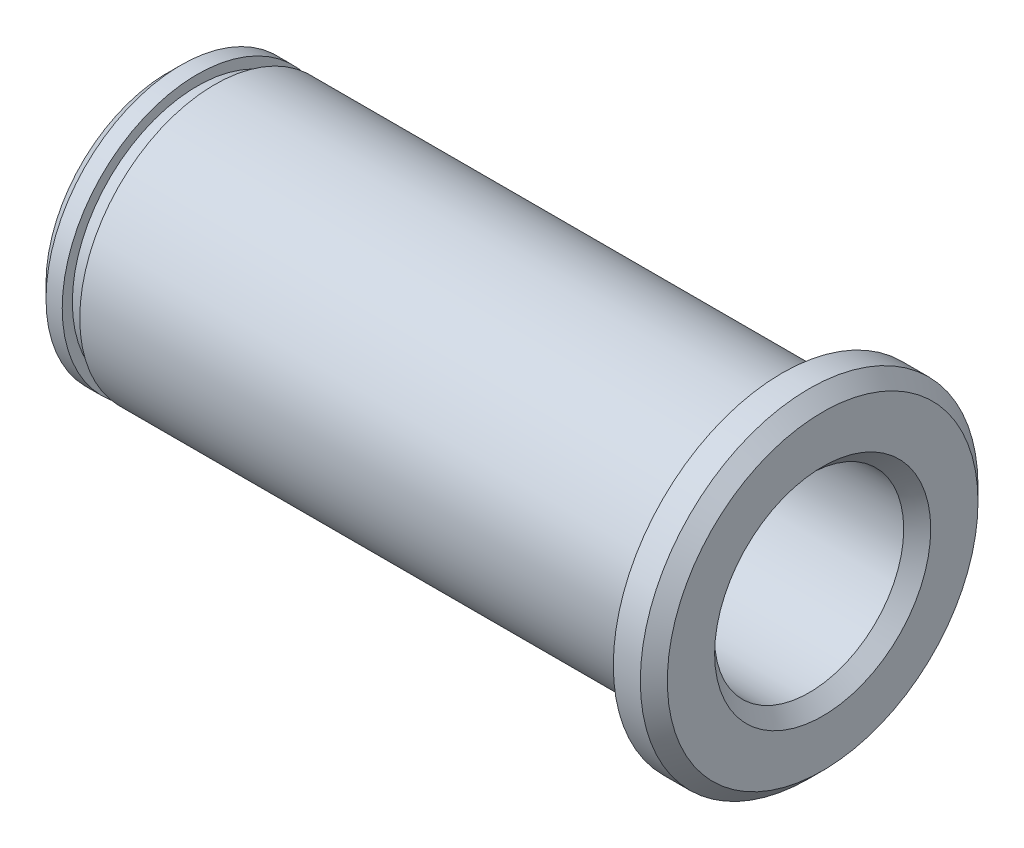
ISO-10303-21;
HEADER;
FILE_DESCRIPTION(('STEP AP214'),'2;1');
FILE_NAME('part.step','',(''),(''),'','','');
FILE_SCHEMA(('AUTOMOTIVE_DESIGN { 1 0 10303 214 1 1 1 1 }'));
ENDSEC;
DATA;
#1=APPLICATION_CONTEXT('core data for automotive mechanical design processes');
#2=APPLICATION_PROTOCOL_DEFINITION('international standard','automotive_design',2000,#1);
#3=PRODUCT_CONTEXT('',#1,'mechanical');
#4=PRODUCT('Part','Part','',(#3));
#5=PRODUCT_RELATED_PRODUCT_CATEGORY('part','',(#4));
#6=PRODUCT_DEFINITION_FORMATION('','',#4);
#7=PRODUCT_DEFINITION_CONTEXT('part definition',#1,'design');
#8=PRODUCT_DEFINITION('design','',#6,#7);
#9=PRODUCT_DEFINITION_SHAPE('','',#8);
#10=(LENGTH_UNIT() NAMED_UNIT(*) SI_UNIT(.MILLI.,.METRE.));
#11=(NAMED_UNIT(*) PLANE_ANGLE_UNIT() SI_UNIT($,.RADIAN.));
#12=(NAMED_UNIT(*) SI_UNIT($,.STERADIAN.) SOLID_ANGLE_UNIT());
#13=UNCERTAINTY_MEASURE_WITH_UNIT(LENGTH_MEASURE(1.E-05),#10,'distance_accuracy_value','');
#14=(GEOMETRIC_REPRESENTATION_CONTEXT(3) GLOBAL_UNCERTAINTY_ASSIGNED_CONTEXT((#13)) GLOBAL_UNIT_ASSIGNED_CONTEXT((#10,
#11,#12)) REPRESENTATION_CONTEXT('',''));
#15=CARTESIAN_POINT('',(0.,0.,0.));
#16=DIRECTION('',(0.,0.,1.));
#17=DIRECTION('',(1.,0.,0.));
#18=AXIS2_PLACEMENT_3D('',#15,#16,#17);
#19=CARTESIAN_POINT('',(0.,-10.,0.));
#20=DIRECTION('',(-1.,0.,0.));
#21=DIRECTION('',(0.,0.,1.));
#22=AXIS2_PLACEMENT_3D('',#19,#20,#21);
#23=PLANE('',#22);
#24=CARTESIAN_POINT('',(0.,0.,0.));
#25=DIRECTION('',(-1.,0.,0.));
#26=DIRECTION('',(0.,0.,1.));
#27=AXIS2_PLACEMENT_3D('',#24,#25,#26);
#28=CIRCLE('',#27,9.);
#29=CARTESIAN_POINT('',(0.,0.,9.));
#30=VERTEX_POINT('',#29);
#31=EDGE_CURVE('E62',#30,#30,#28,.T.);
#32=ORIENTED_EDGE('',*,*,#31,.T.);
#33=EDGE_LOOP('',(#32));
#34=FACE_BOUND('',#33,.T.);
#35=CARTESIAN_POINT('',(0.,0.,0.));
#36=DIRECTION('',(-1.,0.,0.));
#37=DIRECTION('',(0.,0.,1.));
#38=AXIS2_PLACEMENT_3D('',#35,#36,#37);
#39=CIRCLE('',#38,8.00000000000002);
#40=CARTESIAN_POINT('',(0.,0.,8.00000000000002));
#41=VERTEX_POINT('',#40);
#42=EDGE_CURVE('E65',#41,#41,#39,.F.);
#43=ORIENTED_EDGE('',*,*,#42,.T.);
#44=EDGE_LOOP('',(#43));
#45=FACE_BOUND('',#44,.T.);
#46=ADVANCED_FACE('F30',(#34,#45),#23,.T.);
#47=CARTESIAN_POINT('',(0.,0.,0.));
#48=DIRECTION('',(-1.,0.,0.));
#49=DIRECTION('',(0.,0.,1.));
#50=AXIS2_PLACEMENT_3D('',#47,#48,#49);
#51=CYLINDRICAL_SURFACE('',#50,7.00000000000001);
#52=CARTESIAN_POINT('',(1.00000000000001,0.,0.));
#53=DIRECTION('',(-1.,0.,0.));
#54=DIRECTION('',(0.,0.,1.));
#55=AXIS2_PLACEMENT_3D('',#52,#53,#54);
#56=CIRCLE('',#55,7.00000000000001);
#57=CARTESIAN_POINT('',(1.00000000000001,0.,7.00000000000001));
#58=VERTEX_POINT('',#57);
#59=EDGE_CURVE('E41',#58,#58,#56,.T.);
#60=ORIENTED_EDGE('',*,*,#59,.T.);
#61=EDGE_LOOP('',(#60));
#62=FACE_BOUND('',#61,.T.);
#63=CARTESIAN_POINT('',(47.5,0.,0.));
#64=DIRECTION('',(1.,0.,0.));
#65=DIRECTION('',(0.,0.,-1.));
#66=AXIS2_PLACEMENT_3D('',#63,#64,#65);
#67=CIRCLE('',#66,7.00000000000001);
#68=CARTESIAN_POINT('',(47.5,0.,-7.00000000000001));
#69=VERTEX_POINT('',#68);
#70=EDGE_CURVE('E45',#69,#69,#67,.T.);
#71=ORIENTED_EDGE('',*,*,#70,.T.);
#72=EDGE_LOOP('',(#71));
#73=FACE_BOUND('',#72,.T.);
#74=ADVANCED_FACE('F102',(#62,#73),#51,.F.);
#75=CARTESIAN_POINT('',(48.5,-7.00000000000001,0.));
#76=DIRECTION('',(1.,0.,0.));
#77=DIRECTION('',(0.,0.,-1.));
#78=AXIS2_PLACEMENT_3D('',#75,#76,#77);
#79=PLANE('',#78);
#80=CARTESIAN_POINT('',(48.5,0.,0.));
#81=DIRECTION('',(1.,0.,0.));
#82=DIRECTION('',(0.,0.,-1.));
#83=AXIS2_PLACEMENT_3D('',#80,#81,#82);
#84=CIRCLE('',#83,11.5);
#85=CARTESIAN_POINT('',(48.5,0.,-11.5));
#86=VERTEX_POINT('',#85);
#87=EDGE_CURVE('E50',#86,#86,#84,.T.);
#88=ORIENTED_EDGE('',*,*,#87,.T.);
#89=EDGE_LOOP('',(#88));
#90=FACE_BOUND('',#89,.T.);
#91=CARTESIAN_POINT('',(48.5,0.,0.));
#92=DIRECTION('',(1.,0.,0.));
#93=DIRECTION('',(0.,0.,-1.));
#94=AXIS2_PLACEMENT_3D('',#91,#92,#93);
#95=CIRCLE('',#94,8.00000000000001);
#96=CARTESIAN_POINT('',(48.5,0.,-8.00000000000001));
#97=VERTEX_POINT('',#96);
#98=EDGE_CURVE('E53',#97,#97,#95,.F.);
#99=ORIENTED_EDGE('',*,*,#98,.T.);
#100=EDGE_LOOP('',(#99));
#101=FACE_BOUND('',#100,.T.);
#102=ADVANCED_FACE('F108',(#90,#101),#79,.T.);
#103=CARTESIAN_POINT('',(0.,0.,0.));
#104=DIRECTION('',(-1.,0.,0.));
#105=DIRECTION('',(0.,0.,1.));
#106=AXIS2_PLACEMENT_3D('',#103,#104,#105);
#107=CYLINDRICAL_SURFACE('',#106,12.5);
#108=CARTESIAN_POINT('',(47.5,0.,0.));
#109=DIRECTION('',(1.,0.,0.));
#110=DIRECTION('',(0.,0.,-1.));
#111=AXIS2_PLACEMENT_3D('',#108,#109,#110);
#112=CIRCLE('',#111,12.5);
#113=CARTESIAN_POINT('',(47.5,0.,-12.5));
#114=VERTEX_POINT('',#113);
#115=EDGE_CURVE('E56',#114,#114,#112,.F.);
#116=ORIENTED_EDGE('',*,*,#115,.T.);
#117=EDGE_LOOP('',(#116));
#118=FACE_BOUND('',#117,.T.);
#119=CARTESIAN_POINT('',(45.5,0.,0.));
#120=DIRECTION('',(-1.,0.,0.));
#121=DIRECTION('',(0.,0.,1.));
#122=AXIS2_PLACEMENT_3D('',#119,#120,#121);
#123=CIRCLE('',#122,12.5);
#124=CARTESIAN_POINT('',(45.5,0.,12.5));
#125=VERTEX_POINT('',#124);
#126=EDGE_CURVE('E68',#125,#125,#123,.T.);
#127=ORIENTED_EDGE('',*,*,#126,.F.);
#128=EDGE_LOOP('',(#127));
#129=FACE_BOUND('',#128,.T.);
#130=ADVANCED_FACE('F136',(#118,#129),#107,.T.);
#131=CARTESIAN_POINT('',(45.5,-12.5,0.));
#132=DIRECTION('',(-1.,0.,0.));
#133=DIRECTION('',(0.,0.,1.));
#134=AXIS2_PLACEMENT_3D('',#131,#132,#133);
#135=PLANE('',#134);
#136=CARTESIAN_POINT('',(45.5,0.,0.));
#137=DIRECTION('',(-1.,0.,0.));
#138=DIRECTION('',(0.,0.,1.));
#139=AXIS2_PLACEMENT_3D('',#136,#137,#138);
#140=CIRCLE('',#139,10.5);
#141=CARTESIAN_POINT('',(45.5,0.,10.5));
#142=VERTEX_POINT('',#141);
#143=EDGE_CURVE('E10',#142,#142,#140,.F.);
#144=ORIENTED_EDGE('',*,*,#143,.T.);
#145=EDGE_LOOP('',(#144));
#146=FACE_BOUND('',#145,.T.);
#147=ORIENTED_EDGE('',*,*,#126,.T.);
#148=EDGE_LOOP('',(#147));
#149=FACE_BOUND('',#148,.T.);
#150=ADVANCED_FACE('F141',(#146,#149),#135,.T.);
#151=CARTESIAN_POINT('',(0.,0.,0.));
#152=DIRECTION('',(-1.,0.,0.));
#153=DIRECTION('',(0.,0.,1.));
#154=AXIS2_PLACEMENT_3D('',#151,#152,#153);
#155=CYLINDRICAL_SURFACE('',#154,10.);
#156=CARTESIAN_POINT('',(45.,0.,0.));
#157=DIRECTION('',(-1.,0.,0.));
#158=DIRECTION('',(0.,0.,1.));
#159=AXIS2_PLACEMENT_3D('',#156,#157,#158);
#160=CIRCLE('',#159,10.);
#161=CARTESIAN_POINT('',(45.,0.,10.));
#162=VERTEX_POINT('',#161);
#163=EDGE_CURVE('E37',#162,#162,#160,.T.);
#164=ORIENTED_EDGE('',*,*,#163,.T.);
#165=EDGE_LOOP('',(#164));
#166=FACE_BOUND('',#165,.T.);
#167=CARTESIAN_POINT('',(3.5,0.,0.));
#168=DIRECTION('',(-1.,0.,0.));
#169=DIRECTION('',(0.,0.,1.));
#170=AXIS2_PLACEMENT_3D('',#167,#168,#169);
#171=CIRCLE('',#170,10.);
#172=CARTESIAN_POINT('',(3.5,0.,10.));
#173=VERTEX_POINT('',#172);
#174=EDGE_CURVE('E71',#173,#173,#171,.T.);
#175=ORIENTED_EDGE('',*,*,#174,.F.);
#176=EDGE_LOOP('',(#175));
#177=FACE_BOUND('',#176,.T.);
#178=ADVANCED_FACE('F147',(#166,#177),#155,.T.);
#179=CARTESIAN_POINT('',(3.5,-10.,0.));
#180=DIRECTION('',(-1.,0.,0.));
#181=DIRECTION('',(0.,0.,1.));
#182=AXIS2_PLACEMENT_3D('',#179,#180,#181);
#183=PLANE('',#182);
#184=ORIENTED_EDGE('',*,*,#174,.T.);
#185=EDGE_LOOP('',(#184));
#186=FACE_BOUND('',#185,.T.);
#187=CARTESIAN_POINT('',(3.5,0.,0.));
#188=DIRECTION('',(-1.,0.,0.));
#189=DIRECTION('',(0.,0.,1.));
#190=AXIS2_PLACEMENT_3D('',#187,#188,#189);
#191=CIRCLE('',#190,9.25);
#192=CARTESIAN_POINT('',(3.5,0.,9.25));
#193=VERTEX_POINT('',#192);
#194=EDGE_CURVE('E74',#193,#193,#191,.T.);
#195=ORIENTED_EDGE('',*,*,#194,.F.);
#196=EDGE_LOOP('',(#195));
#197=FACE_BOUND('',#196,.T.);
#198=ADVANCED_FACE('F98',(#186,#197),#183,.T.);
#199=CARTESIAN_POINT('',(0.,0.,0.));
#200=DIRECTION('',(-1.,0.,0.));
#201=DIRECTION('',(0.,0.,1.));
#202=AXIS2_PLACEMENT_3D('',#199,#200,#201);
#203=CYLINDRICAL_SURFACE('',#202,9.25);
#204=ORIENTED_EDGE('',*,*,#194,.T.);
#205=EDGE_LOOP('',(#204));
#206=FACE_BOUND('',#205,.T.);
#207=CARTESIAN_POINT('',(2.2,0.,0.));
#208=DIRECTION('',(-1.,0.,0.));
#209=DIRECTION('',(0.,0.,1.));
#210=AXIS2_PLACEMENT_3D('',#207,#208,#209);
#211=CIRCLE('',#210,9.25);
#212=CARTESIAN_POINT('',(2.2,0.,9.25));
#213=VERTEX_POINT('',#212);
#214=EDGE_CURVE('E77',#213,#213,#211,.T.);
#215=ORIENTED_EDGE('',*,*,#214,.F.);
#216=EDGE_LOOP('',(#215));
#217=FACE_BOUND('',#216,.T.);
#218=ADVANCED_FACE('F88',(#206,#217),#203,.T.);
#219=CARTESIAN_POINT('',(2.2,-9.25,0.));
#220=DIRECTION('',(1.,0.,0.));
#221=DIRECTION('',(0.,0.,-1.));
#222=AXIS2_PLACEMENT_3D('',#219,#220,#221);
#223=PLANE('',#222);
#224=ORIENTED_EDGE('',*,*,#214,.T.);
#225=EDGE_LOOP('',(#224));
#226=FACE_BOUND('',#225,.T.);
#227=CARTESIAN_POINT('',(2.2,0.,0.));
#228=DIRECTION('',(-1.,0.,0.));
#229=DIRECTION('',(0.,0.,1.));
#230=AXIS2_PLACEMENT_3D('',#227,#228,#229);
#231=CIRCLE('',#230,10.);
#232=CARTESIAN_POINT('',(2.2,0.,10.));
#233=VERTEX_POINT('',#232);
#234=EDGE_CURVE('E80',#233,#233,#231,.T.);
#235=ORIENTED_EDGE('',*,*,#234,.F.);
#236=EDGE_LOOP('',(#235));
#237=FACE_BOUND('',#236,.T.);
#238=ADVANCED_FACE('F86',(#226,#237),#223,.T.);
#239=CARTESIAN_POINT('',(0.,0.,0.));
#240=DIRECTION('',(-1.,0.,0.));
#241=DIRECTION('',(0.,0.,1.));
#242=AXIS2_PLACEMENT_3D('',#239,#240,#241);
#243=CYLINDRICAL_SURFACE('',#242,10.);
#244=CARTESIAN_POINT('',(0.999999999999997,0.,0.));
#245=DIRECTION('',(-1.,0.,0.));
#246=DIRECTION('',(0.,0.,1.));
#247=AXIS2_PLACEMENT_3D('',#244,#245,#246);
#248=CIRCLE('',#247,10.);
#249=CARTESIAN_POINT('',(0.999999999999997,0.,10.));
#250=VERTEX_POINT('',#249);
#251=EDGE_CURVE('E59',#250,#250,#248,.F.);
#252=ORIENTED_EDGE('',*,*,#251,.T.);
#253=EDGE_LOOP('',(#252));
#254=FACE_BOUND('',#253,.T.);
#255=ORIENTED_EDGE('',*,*,#234,.T.);
#256=EDGE_LOOP('',(#255));
#257=FACE_BOUND('',#256,.T.);
#258=ADVANCED_FACE('F84',(#254,#257),#243,.T.);
#259=CARTESIAN_POINT('',(0.,0.,0.));
#260=DIRECTION('',(1.,0.,0.));
#261=DIRECTION('',(0.,0.,-1.));
#262=AXIS2_PLACEMENT_3D('',#259,#260,#261);
#263=CONICAL_SURFACE('',#262,9.,0.785398163397452);
#264=ORIENTED_EDGE('',*,*,#251,.F.);
#265=EDGE_LOOP('',(#264));
#266=FACE_BOUND('',#265,.T.);
#267=ORIENTED_EDGE('',*,*,#31,.F.);
#268=EDGE_LOOP('',(#267));
#269=FACE_BOUND('',#268,.T.);
#270=ADVANCED_FACE('F95',(#266,#269),#263,.T.);
#271=CARTESIAN_POINT('',(47.5,0.,0.));
#272=DIRECTION('',(-1.,0.,0.));
#273=DIRECTION('',(0.,0.,1.));
#274=AXIS2_PLACEMENT_3D('',#271,#272,#273);
#275=CONICAL_SURFACE('',#274,12.5,0.785398163397451);
#276=ORIENTED_EDGE('',*,*,#87,.F.);
#277=EDGE_LOOP('',(#276));
#278=FACE_BOUND('',#277,.T.);
#279=ORIENTED_EDGE('',*,*,#115,.F.);
#280=EDGE_LOOP('',(#279));
#281=FACE_BOUND('',#280,.T.);
#282=ADVANCED_FACE('F116',(#278,#281),#275,.T.);
#283=CARTESIAN_POINT('',(1.00000000000001,0.,0.));
#284=DIRECTION('',(-1.,0.,0.));
#285=DIRECTION('',(0.,0.,1.));
#286=AXIS2_PLACEMENT_3D('',#283,#284,#285);
#287=CONICAL_SURFACE('',#286,7.00000000000001,0.78539816339745);
#288=ORIENTED_EDGE('',*,*,#42,.F.);
#289=EDGE_LOOP('',(#288));
#290=FACE_BOUND('',#289,.T.);
#291=ORIENTED_EDGE('',*,*,#59,.F.);
#292=EDGE_LOOP('',(#291));
#293=FACE_BOUND('',#292,.T.);
#294=ADVANCED_FACE('F120',(#290,#293),#287,.F.);
#295=CARTESIAN_POINT('',(48.5,0.,0.));
#296=DIRECTION('',(1.,0.,0.));
#297=DIRECTION('',(0.,0.,-1.));
#298=AXIS2_PLACEMENT_3D('',#295,#296,#297);
#299=CONICAL_SURFACE('',#298,8.00000000000001,0.785398163397449);
#300=ORIENTED_EDGE('',*,*,#70,.F.);
#301=EDGE_LOOP('',(#300));
#302=FACE_BOUND('',#301,.T.);
#303=ORIENTED_EDGE('',*,*,#98,.F.);
#304=EDGE_LOOP('',(#303));
#305=FACE_BOUND('',#304,.T.);
#306=ADVANCED_FACE('F123',(#302,#305),#299,.F.);
#307=CARTESIAN_POINT('',(45.,0.,0.));
#308=DIRECTION('',(-1.,0.,0.));
#309=DIRECTION('',(0.,0.,1.));
#310=AXIS2_PLACEMENT_3D('',#307,#308,#309);
#311=TOROIDAL_SURFACE('',#310,10.5,0.5);
#312=ORIENTED_EDGE('',*,*,#143,.F.);
#313=EDGE_LOOP('',(#312));
#314=FACE_BOUND('',#313,.T.);
#315=ORIENTED_EDGE('',*,*,#163,.F.);
#316=EDGE_LOOP('',(#315));
#317=FACE_BOUND('',#316,.T.);
#318=ADVANCED_FACE('F32',(#314,#317),#311,.F.);
#319=CLOSED_SHELL('',(#46,#74,#102,#130,#150,#178,#198,#218,#238,#258,#270,#282,#294,#306,#318));
#320=MANIFOLD_SOLID_BREP('B2',#319);
#321=ADVANCED_BREP_SHAPE_REPRESENTATION('',(#18,#320),#14);
#322=SHAPE_DEFINITION_REPRESENTATION(#9,#321);
ENDSEC;
END-ISO-10303-21;
